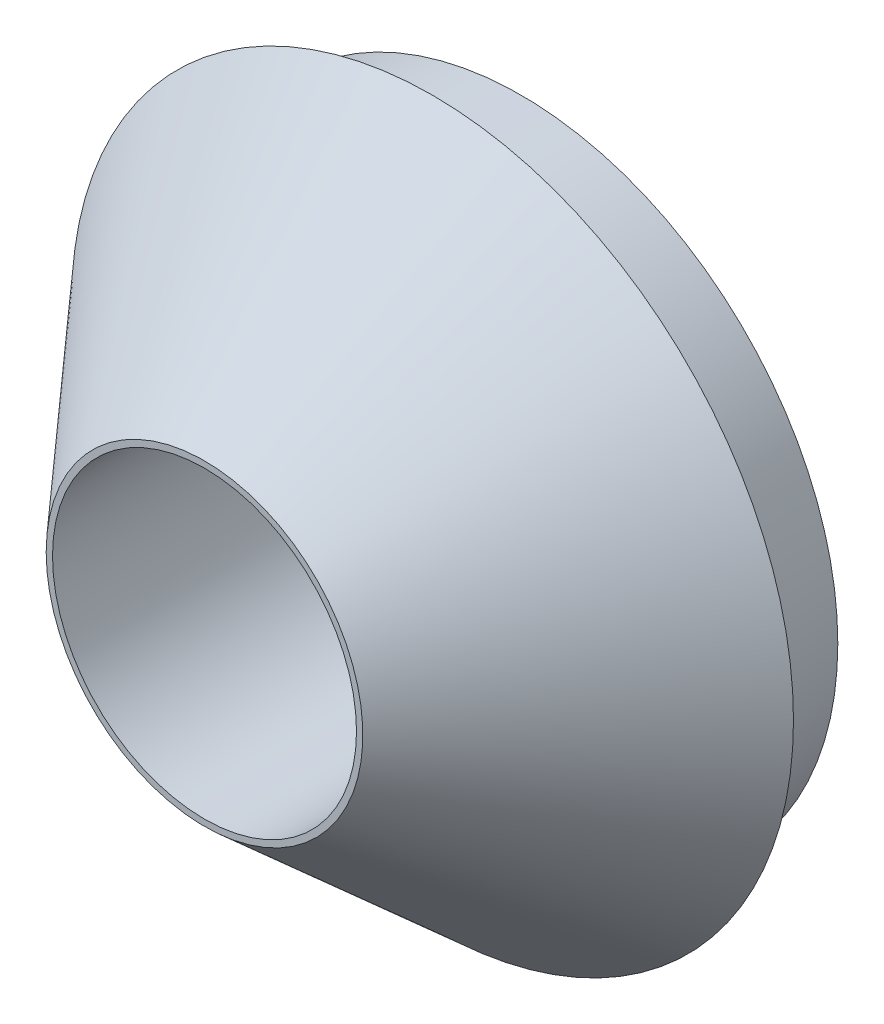
ISO-10303-21;
HEADER;
FILE_DESCRIPTION(('STEP AP214'),'2;1');
FILE_NAME('part.step','',(''),(''),'','','');
FILE_SCHEMA(('AUTOMOTIVE_DESIGN { 1 0 10303 214 1 1 1 1 }'));
ENDSEC;
DATA;
#1=APPLICATION_CONTEXT('core data for automotive mechanical design processes');
#2=APPLICATION_PROTOCOL_DEFINITION('international standard','automotive_design',2000,#1);
#3=PRODUCT_CONTEXT('',#1,'mechanical');
#4=PRODUCT('Part','Part','',(#3));
#5=PRODUCT_RELATED_PRODUCT_CATEGORY('part','',(#4));
#6=PRODUCT_DEFINITION_FORMATION('','',#4);
#7=PRODUCT_DEFINITION_CONTEXT('part definition',#1,'design');
#8=PRODUCT_DEFINITION('design','',#6,#7);
#9=PRODUCT_DEFINITION_SHAPE('','',#8);
#10=(LENGTH_UNIT() NAMED_UNIT(*) SI_UNIT(.MILLI.,.METRE.));
#11=(NAMED_UNIT(*) PLANE_ANGLE_UNIT() SI_UNIT($,.RADIAN.));
#12=(NAMED_UNIT(*) SI_UNIT($,.STERADIAN.) SOLID_ANGLE_UNIT());
#13=UNCERTAINTY_MEASURE_WITH_UNIT(LENGTH_MEASURE(1.E-05),#10,'distance_accuracy_value','');
#14=(GEOMETRIC_REPRESENTATION_CONTEXT(3) GLOBAL_UNCERTAINTY_ASSIGNED_CONTEXT((#13)) GLOBAL_UNIT_ASSIGNED_CONTEXT((#10,
#11,#12)) REPRESENTATION_CONTEXT('',''));
#15=CARTESIAN_POINT('',(0.,0.,0.));
#16=DIRECTION('',(0.,0.,1.));
#17=DIRECTION('',(1.,0.,0.));
#18=AXIS2_PLACEMENT_3D('',#15,#16,#17);
#19=CARTESIAN_POINT('',(0.,0.,0.));
#20=DIRECTION('',(0.,0.,-1.));
#21=DIRECTION('',(-1.,0.,0.));
#22=AXIS2_PLACEMENT_3D('',#19,#20,#21);
#23=PLANE('',#22);
#24=CARTESIAN_POINT('',(0.,0.,0.));
#25=DIRECTION('',(0.,0.,-1.));
#26=DIRECTION('',(-1.,0.,0.));
#27=AXIS2_PLACEMENT_3D('',#24,#25,#26);
#28=CIRCLE('',#27,6.096);
#29=CARTESIAN_POINT('',(-6.096,0.,0.));
#30=VERTEX_POINT('',#29);
#31=EDGE_CURVE('E60',#30,#30,#28,.T.);
#32=ORIENTED_EDGE('',*,*,#31,.T.);
#33=EDGE_LOOP('',(#32));
#34=FACE_BOUND('',#33,.T.);
#35=CARTESIAN_POINT('',(0.,0.,0.));
#36=DIRECTION('',(0.,0.,-1.));
#37=DIRECTION('',(-1.,0.,0.));
#38=AXIS2_PLACEMENT_3D('',#35,#36,#37);
#39=CIRCLE('',#38,6.35);
#40=CARTESIAN_POINT('',(-6.35,0.,0.));
#41=VERTEX_POINT('',#40);
#42=EDGE_CURVE('E10',#41,#41,#39,.T.);
#43=ORIENTED_EDGE('',*,*,#42,.F.);
#44=EDGE_LOOP('',(#43));
#45=FACE_BOUND('',#44,.T.);
#46=ADVANCED_FACE('F37',(#34,#45),#23,.F.);
#47=CARTESIAN_POINT('',(0.,0.,0.));
#48=DIRECTION('',(0.,0.,-1.));
#49=DIRECTION('',(-1.,0.,0.));
#50=AXIS2_PLACEMENT_3D('',#47,#48,#49);
#51=CONICAL_SURFACE('',#50,6.35,0.726642340681726);
#52=CARTESIAN_POINT('',(0.,0.,-9.144));
#53=DIRECTION('',(0.,0.,-1.));
#54=DIRECTION('',(-1.,0.,0.));
#55=AXIS2_PLACEMENT_3D('',#52,#53,#54);
#56=CIRCLE('',#55,14.478);
#57=CARTESIAN_POINT('',(-14.478,0.,-9.144));
#58=VERTEX_POINT('',#57);
#59=EDGE_CURVE('E44',#58,#58,#56,.T.);
#60=ORIENTED_EDGE('',*,*,#59,.F.);
#61=EDGE_LOOP('',(#60));
#62=FACE_BOUND('',#61,.T.);
#63=ORIENTED_EDGE('',*,*,#42,.T.);
#64=EDGE_LOOP('',(#63));
#65=FACE_BOUND('',#64,.T.);
#66=ADVANCED_FACE('F91',(#62,#65),#51,.T.);
#67=CARTESIAN_POINT('',(14.478,0.,-9.144));
#68=DIRECTION('',(0.,0.,1.));
#69=DIRECTION('',(1.,0.,0.));
#70=AXIS2_PLACEMENT_3D('',#67,#68,#69);
#71=PLANE('',#70);
#72=CARTESIAN_POINT('',(0.,0.,-9.144));
#73=DIRECTION('',(0.,0.,-1.));
#74=DIRECTION('',(-1.,0.,0.));
#75=AXIS2_PLACEMENT_3D('',#72,#73,#74);
#76=CIRCLE('',#75,12.7);
#77=CARTESIAN_POINT('',(-12.7,0.,-9.144));
#78=VERTEX_POINT('',#77);
#79=EDGE_CURVE('E49',#78,#78,#76,.T.);
#80=ORIENTED_EDGE('',*,*,#79,.F.);
#81=EDGE_LOOP('',(#80));
#82=FACE_BOUND('',#81,.T.);
#83=ORIENTED_EDGE('',*,*,#59,.T.);
#84=EDGE_LOOP('',(#83));
#85=FACE_BOUND('',#84,.T.);
#86=ADVANCED_FACE('F86',(#82,#85),#71,.F.);
#87=CARTESIAN_POINT('',(0.,0.,-12.7));
#88=DIRECTION('',(0.,0.,-1.));
#89=DIRECTION('',(-1.,0.,0.));
#90=AXIS2_PLACEMENT_3D('',#87,#88,#89);
#91=CYLINDRICAL_SURFACE('',#90,12.7);
#92=CARTESIAN_POINT('',(0.,0.,-12.7));
#93=DIRECTION('',(0.,0.,-1.));
#94=DIRECTION('',(-1.,0.,0.));
#95=AXIS2_PLACEMENT_3D('',#92,#93,#94);
#96=CIRCLE('',#95,12.7);
#97=CARTESIAN_POINT('',(-12.7,0.,-12.7));
#98=VERTEX_POINT('',#97);
#99=EDGE_CURVE('E54',#98,#98,#96,.T.);
#100=ORIENTED_EDGE('',*,*,#99,.F.);
#101=EDGE_LOOP('',(#100));
#102=FACE_BOUND('',#101,.T.);
#103=ORIENTED_EDGE('',*,*,#79,.T.);
#104=EDGE_LOOP('',(#103));
#105=FACE_BOUND('',#104,.T.);
#106=ADVANCED_FACE('F80',(#102,#105),#91,.T.);
#107=CARTESIAN_POINT('',(12.7,0.,-12.7));
#108=DIRECTION('',(0.,0.,1.));
#109=DIRECTION('',(1.,0.,0.));
#110=AXIS2_PLACEMENT_3D('',#107,#108,#109);
#111=PLANE('',#110);
#112=CARTESIAN_POINT('',(0.,0.,-12.7));
#113=DIRECTION('',(0.,0.,-1.));
#114=DIRECTION('',(-1.,0.,0.));
#115=AXIS2_PLACEMENT_3D('',#112,#113,#114);
#116=CIRCLE('',#115,6.096);
#117=CARTESIAN_POINT('',(-6.096,0.,-12.7));
#118=VERTEX_POINT('',#117);
#119=EDGE_CURVE('E61',#118,#118,#116,.T.);
#120=ORIENTED_EDGE('',*,*,#119,.F.);
#121=EDGE_LOOP('',(#120));
#122=FACE_BOUND('',#121,.T.);
#123=ORIENTED_EDGE('',*,*,#99,.T.);
#124=EDGE_LOOP('',(#123));
#125=FACE_BOUND('',#124,.T.);
#126=ADVANCED_FACE('F74',(#122,#125),#111,.F.);
#127=CARTESIAN_POINT('',(0.,0.,0.));
#128=DIRECTION('',(0.,0.,-1.));
#129=DIRECTION('',(-1.,0.,0.));
#130=AXIS2_PLACEMENT_3D('',#127,#128,#129);
#131=CYLINDRICAL_SURFACE('',#130,6.096);
#132=ORIENTED_EDGE('',*,*,#31,.F.);
#133=EDGE_LOOP('',(#132));
#134=FACE_BOUND('',#133,.T.);
#135=ORIENTED_EDGE('',*,*,#119,.T.);
#136=EDGE_LOOP('',(#135));
#137=FACE_BOUND('',#136,.T.);
#138=ADVANCED_FACE('F71',(#134,#137),#131,.F.);
#139=CLOSED_SHELL('',(#46,#66,#86,#106,#126,#138));
#140=MANIFOLD_SOLID_BREP('B2',#139);
#141=ADVANCED_BREP_SHAPE_REPRESENTATION('',(#18,#140),#14);
#142=SHAPE_DEFINITION_REPRESENTATION(#9,#141);
ENDSEC;
END-ISO-10303-21;
